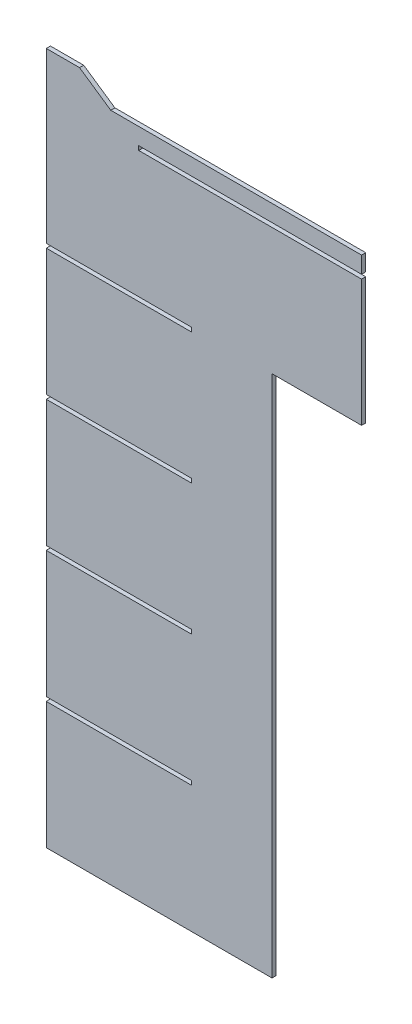
ISO-10303-21;
HEADER;
FILE_DESCRIPTION(('STEP AP214'),'2;1');
FILE_NAME('part.step','',(''),(''),'','','');
FILE_SCHEMA(('AUTOMOTIVE_DESIGN { 1 0 10303 214 1 1 1 1 }'));
ENDSEC;
DATA;
#1=APPLICATION_CONTEXT('core data for automotive mechanical design processes');
#2=APPLICATION_PROTOCOL_DEFINITION('international standard','automotive_design',2000,#1);
#3=PRODUCT_CONTEXT('',#1,'mechanical');
#4=PRODUCT('Part','Part','',(#3));
#5=PRODUCT_RELATED_PRODUCT_CATEGORY('part','',(#4));
#6=PRODUCT_DEFINITION_FORMATION('','',#4);
#7=PRODUCT_DEFINITION_CONTEXT('part definition',#1,'design');
#8=PRODUCT_DEFINITION('design','',#6,#7);
#9=PRODUCT_DEFINITION_SHAPE('','',#8);
#10=(LENGTH_UNIT() NAMED_UNIT(*) SI_UNIT(.MILLI.,.METRE.));
#11=(NAMED_UNIT(*) PLANE_ANGLE_UNIT() SI_UNIT($,.RADIAN.));
#12=(NAMED_UNIT(*) SI_UNIT($,.STERADIAN.) SOLID_ANGLE_UNIT());
#13=UNCERTAINTY_MEASURE_WITH_UNIT(LENGTH_MEASURE(1.E-05),#10,'distance_accuracy_value','');
#14=(GEOMETRIC_REPRESENTATION_CONTEXT(3) GLOBAL_UNCERTAINTY_ASSIGNED_CONTEXT((#13)) GLOBAL_UNIT_ASSIGNED_CONTEXT((#10,
#11,#12)) REPRESENTATION_CONTEXT('',''));
#15=CARTESIAN_POINT('',(0.,0.,0.));
#16=DIRECTION('',(0.,0.,1.));
#17=DIRECTION('',(1.,0.,0.));
#18=AXIS2_PLACEMENT_3D('',#15,#16,#17);
#19=CARTESIAN_POINT('',(129.013076167851,254.245404572339,3.175));
#20=DIRECTION('',(0.,-1.,0.));
#21=DIRECTION('',(0.,0.,-1.));
#22=AXIS2_PLACEMENT_3D('',#19,#20,#21);
#23=PLANE('',#22);
#24=DIRECTION('',(-1.,0.,0.));
#25=VECTOR('',#24,1.);
#26=CARTESIAN_POINT('',(129.013076167851,254.245404572339,0.));
#27=LINE('',#26,#25);
#28=CARTESIAN_POINT('',(221.723076167851,254.245404572339,0.));
#29=VERTEX_POINT('',#28);
#30=CARTESIAN_POINT('',(51.8072361678516,254.245404572339,0.));
#31=VERTEX_POINT('',#30);
#32=EDGE_CURVE('E210',#29,#31,#27,.T.);
#33=ORIENTED_EDGE('',*,*,#32,.T.);
#34=DIRECTION('',(0.,0.,1.));
#35=VECTOR('',#34,1.);
#36=CARTESIAN_POINT('',(51.8072361678516,254.245404572339,0.));
#37=LINE('',#36,#35);
#38=CARTESIAN_POINT('',(51.8072361678516,254.245404572339,3.175));
#39=VERTEX_POINT('',#38);
#40=EDGE_CURVE('E449',#31,#39,#37,.T.);
#41=ORIENTED_EDGE('',*,*,#40,.T.);
#42=DIRECTION('',(-1.,0.,0.));
#43=VECTOR('',#42,1.);
#44=CARTESIAN_POINT('',(129.013076167851,254.245404572339,3.175));
#45=LINE('',#44,#43);
#46=CARTESIAN_POINT('',(221.723076167851,254.245404572339,3.175));
#47=VERTEX_POINT('',#46);
#48=EDGE_CURVE('E268',#47,#39,#45,.T.);
#49=ORIENTED_EDGE('',*,*,#48,.F.);
#50=DIRECTION('',(0.,0.,1.));
#51=VECTOR('',#50,1.);
#52=CARTESIAN_POINT('',(221.723076167851,254.245404572339,0.));
#53=LINE('',#52,#51);
#54=EDGE_CURVE('E525',#29,#47,#53,.T.);
#55=ORIENTED_EDGE('',*,*,#54,.F.);
#56=EDGE_LOOP('',(#33,#41,#49,#55));
#57=FACE_BOUND('',#56,.T.);
#58=ADVANCED_FACE('F39',(#57),#23,.F.);
#59=CARTESIAN_POINT('',(-18.6853838321491,254.245404572339,3.175));
#60=DIRECTION('',(1.,0.,0.));
#61=DIRECTION('',(0.,0.,-1.));
#62=AXIS2_PLACEMENT_3D('',#59,#60,#61);
#63=PLANE('',#62);
#64=DIRECTION('',(0.,-1.,0.));
#65=VECTOR('',#64,1.);
#66=CARTESIAN_POINT('',(-18.6853838321491,254.245404572339,0.));
#67=LINE('',#66,#65);
#68=CARTESIAN_POINT('',(-18.6853838321491,286.376404572339,0.));
#69=VERTEX_POINT('',#68);
#70=CARTESIAN_POINT('',(-18.6853838321491,157.66698457234,0.));
#71=VERTEX_POINT('',#70);
#72=EDGE_CURVE('E214',#69,#71,#67,.T.);
#73=ORIENTED_EDGE('',*,*,#72,.T.);
#74=DIRECTION('',(0.,0.,-1.));
#75=VECTOR('',#74,1.);
#76=CARTESIAN_POINT('',(-18.6853838321491,157.66698457234,3.175));
#77=LINE('',#76,#75);
#78=CARTESIAN_POINT('',(-18.6853838321491,157.66698457234,3.175));
#79=VERTEX_POINT('',#78);
#80=EDGE_CURVE('E11',#79,#71,#77,.T.);
#81=ORIENTED_EDGE('',*,*,#80,.F.);
#82=DIRECTION('',(0.,-1.,0.));
#83=VECTOR('',#82,1.);
#84=CARTESIAN_POINT('',(-18.6853838321491,254.245404572339,3.175));
#85=LINE('',#84,#83);
#86=CARTESIAN_POINT('',(-18.6853838321491,286.376404572339,3.175));
#87=VERTEX_POINT('',#86);
#88=EDGE_CURVE('E131',#87,#79,#85,.T.);
#89=ORIENTED_EDGE('',*,*,#88,.F.);
#90=DIRECTION('',(0.,0.,1.));
#91=VECTOR('',#90,1.);
#92=CARTESIAN_POINT('',(-18.6853838321491,286.376404572339,0.));
#93=LINE('',#92,#91);
#94=EDGE_CURVE('E444',#69,#87,#93,.T.);
#95=ORIENTED_EDGE('',*,*,#94,.F.);
#96=EDGE_LOOP('',(#73,#81,#89,#95));
#97=FACE_BOUND('',#96,.T.);
#98=ADVANCED_FACE('F445',(#97),#63,.F.);
#99=CARTESIAN_POINT('',(92.0884611678498,157.66698457234,3.175));
#100=DIRECTION('',(0.,1.,0.));
#101=DIRECTION('',(0.,0.,1.));
#102=AXIS2_PLACEMENT_3D('',#99,#100,#101);
#103=PLANE('',#102);
#104=DIRECTION('',(1.,0.,0.));
#105=VECTOR('',#104,1.);
#106=CARTESIAN_POINT('',(92.0884611678498,157.66698457234,0.));
#107=LINE('',#106,#105);
#108=CARTESIAN_POINT('',(92.0884611678498,157.66698457234,0.));
#109=VERTEX_POINT('',#108);
#110=EDGE_CURVE('E218',#71,#109,#107,.T.);
#111=ORIENTED_EDGE('',*,*,#110,.T.);
#112=DIRECTION('',(0.,0.,-1.));
#113=VECTOR('',#112,1.);
#114=CARTESIAN_POINT('',(92.0884611678498,157.66698457234,3.175));
#115=LINE('',#114,#113);
#116=CARTESIAN_POINT('',(92.0884611678498,157.66698457234,3.175));
#117=VERTEX_POINT('',#116);
#118=EDGE_CURVE('E47',#117,#109,#115,.T.);
#119=ORIENTED_EDGE('',*,*,#118,.F.);
#120=DIRECTION('',(1.,0.,0.));
#121=VECTOR('',#120,1.);
#122=CARTESIAN_POINT('',(92.0884611678498,157.66698457234,3.175));
#123=LINE('',#122,#121);
#124=EDGE_CURVE('E504',#79,#117,#123,.T.);
#125=ORIENTED_EDGE('',*,*,#124,.F.);
#126=ORIENTED_EDGE('',*,*,#80,.T.);
#127=EDGE_LOOP('',(#111,#119,#125,#126));
#128=FACE_BOUND('',#127,.T.);
#129=ADVANCED_FACE('F507',(#128),#103,.F.);
#130=CARTESIAN_POINT('',(92.0884611678498,157.66698457234,3.175));
#131=DIRECTION('',(1.,0.,0.));
#132=DIRECTION('',(0.,0.,-1.));
#133=AXIS2_PLACEMENT_3D('',#130,#131,#132);
#134=PLANE('',#133);
#135=DIRECTION('',(0.,-1.,0.));
#136=VECTOR('',#135,1.);
#137=CARTESIAN_POINT('',(92.0884611678498,157.66698457234,0.));
#138=LINE('',#137,#136);
#139=CARTESIAN_POINT('',(92.0884611678498,154.49198457234,0.));
#140=VERTEX_POINT('',#139);
#141=EDGE_CURVE('E221',#109,#140,#138,.T.);
#142=ORIENTED_EDGE('',*,*,#141,.T.);
#143=DIRECTION('',(0.,0.,-1.));
#144=VECTOR('',#143,1.);
#145=CARTESIAN_POINT('',(92.0884611678498,154.49198457234,3.175));
#146=LINE('',#145,#144);
#147=CARTESIAN_POINT('',(92.0884611678498,154.49198457234,3.175));
#148=VERTEX_POINT('',#147);
#149=EDGE_CURVE('E315',#148,#140,#146,.T.);
#150=ORIENTED_EDGE('',*,*,#149,.F.);
#151=DIRECTION('',(0.,-1.,0.));
#152=VECTOR('',#151,1.);
#153=CARTESIAN_POINT('',(92.0884611678498,157.66698457234,3.175));
#154=LINE('',#153,#152);
#155=EDGE_CURVE('E326',#117,#148,#154,.T.);
#156=ORIENTED_EDGE('',*,*,#155,.F.);
#157=ORIENTED_EDGE('',*,*,#118,.T.);
#158=EDGE_LOOP('',(#142,#150,#156,#157));
#159=FACE_BOUND('',#158,.T.);
#160=ADVANCED_FACE('F324',(#159),#134,.F.);
#161=CARTESIAN_POINT('',(92.0884611678498,154.49198457234,3.175));
#162=DIRECTION('',(0.,-1.,0.));
#163=DIRECTION('',(1.,0.,0.));
#164=AXIS2_PLACEMENT_3D('',#161,#162,#163);
#165=PLANE('',#164);
#166=DIRECTION('',(-1.,0.,0.));
#167=VECTOR('',#166,1.);
#168=CARTESIAN_POINT('',(92.0884611678498,154.49198457234,0.));
#169=LINE('',#168,#167);
#170=CARTESIAN_POINT('',(-18.6853838321491,154.49198457234,0.));
#171=VERTEX_POINT('',#170);
#172=EDGE_CURVE('E224',#140,#171,#169,.T.);
#173=ORIENTED_EDGE('',*,*,#172,.T.);
#174=DIRECTION('',(0.,0.,-1.));
#175=VECTOR('',#174,1.);
#176=CARTESIAN_POINT('',(-18.6853838321491,154.49198457234,3.175));
#177=LINE('',#176,#175);
#178=CARTESIAN_POINT('',(-18.6853838321491,154.49198457234,3.175));
#179=VERTEX_POINT('',#178);
#180=EDGE_CURVE('E311',#179,#171,#177,.T.);
#181=ORIENTED_EDGE('',*,*,#180,.F.);
#182=DIRECTION('',(-1.,0.,0.));
#183=VECTOR('',#182,1.);
#184=CARTESIAN_POINT('',(92.0884611678498,154.49198457234,3.175));
#185=LINE('',#184,#183);
#186=EDGE_CURVE('E349',#148,#179,#185,.T.);
#187=ORIENTED_EDGE('',*,*,#186,.F.);
#188=ORIENTED_EDGE('',*,*,#149,.T.);
#189=EDGE_LOOP('',(#173,#181,#187,#188));
#190=FACE_BOUND('',#189,.T.);
#191=ADVANCED_FACE('F339',(#190),#165,.F.);
#192=CARTESIAN_POINT('',(-18.6853838321491,154.49198457234,3.175));
#193=DIRECTION('',(1.,0.,0.));
#194=DIRECTION('',(0.,0.,-1.));
#195=AXIS2_PLACEMENT_3D('',#192,#193,#194);
#196=PLANE('',#195);
#197=DIRECTION('',(0.,-1.,0.));
#198=VECTOR('',#197,1.);
#199=CARTESIAN_POINT('',(-18.6853838321491,154.49198457234,0.));
#200=LINE('',#199,#198);
#201=CARTESIAN_POINT('',(-18.6853838321491,57.9135645723403,0.));
#202=VERTEX_POINT('',#201);
#203=EDGE_CURVE('E227',#171,#202,#200,.T.);
#204=ORIENTED_EDGE('',*,*,#203,.T.);
#205=DIRECTION('',(0.,0.,-1.));
#206=VECTOR('',#205,1.);
#207=CARTESIAN_POINT('',(-18.6853838321491,57.9135645723403,3.175));
#208=LINE('',#207,#206);
#209=CARTESIAN_POINT('',(-18.6853838321491,57.9135645723403,3.175));
#210=VERTEX_POINT('',#209);
#211=EDGE_CURVE('E307',#210,#202,#208,.T.);
#212=ORIENTED_EDGE('',*,*,#211,.F.);
#213=DIRECTION('',(0.,-1.,0.));
#214=VECTOR('',#213,1.);
#215=CARTESIAN_POINT('',(-18.6853838321491,154.49198457234,3.175));
#216=LINE('',#215,#214);
#217=EDGE_CURVE('E345',#179,#210,#216,.T.);
#218=ORIENTED_EDGE('',*,*,#217,.F.);
#219=ORIENTED_EDGE('',*,*,#180,.T.);
#220=EDGE_LOOP('',(#204,#212,#218,#219));
#221=FACE_BOUND('',#220,.T.);
#222=ADVANCED_FACE('F343',(#221),#196,.F.);
#223=CARTESIAN_POINT('',(92.0884611678505,57.9135645723403,3.175));
#224=DIRECTION('',(0.,1.,0.));
#225=DIRECTION('',(0.,0.,1.));
#226=AXIS2_PLACEMENT_3D('',#223,#224,#225);
#227=PLANE('',#226);
#228=DIRECTION('',(1.,0.,0.));
#229=VECTOR('',#228,1.);
#230=CARTESIAN_POINT('',(92.0884611678505,57.9135645723403,0.));
#231=LINE('',#230,#229);
#232=CARTESIAN_POINT('',(92.0884611678505,57.9135645723403,0.));
#233=VERTEX_POINT('',#232);
#234=EDGE_CURVE('E230',#202,#233,#231,.T.);
#235=ORIENTED_EDGE('',*,*,#234,.T.);
#236=DIRECTION('',(0.,0.,-1.));
#237=VECTOR('',#236,1.);
#238=CARTESIAN_POINT('',(92.0884611678505,57.9135645723403,3.175));
#239=LINE('',#238,#237);
#240=CARTESIAN_POINT('',(92.0884611678505,57.9135645723403,3.175));
#241=VERTEX_POINT('',#240);
#242=EDGE_CURVE('E303',#241,#233,#239,.T.);
#243=ORIENTED_EDGE('',*,*,#242,.F.);
#244=DIRECTION('',(1.,0.,0.));
#245=VECTOR('',#244,1.);
#246=CARTESIAN_POINT('',(92.0884611678505,57.9135645723403,3.175));
#247=LINE('',#246,#245);
#248=EDGE_CURVE('E348',#210,#241,#247,.T.);
#249=ORIENTED_EDGE('',*,*,#248,.F.);
#250=ORIENTED_EDGE('',*,*,#211,.T.);
#251=EDGE_LOOP('',(#235,#243,#249,#250));
#252=FACE_BOUND('',#251,.T.);
#253=ADVANCED_FACE('F640',(#252),#227,.F.);
#254=CARTESIAN_POINT('',(92.0884611678505,57.9135645723403,3.175));
#255=DIRECTION('',(1.,0.,0.));
#256=DIRECTION('',(0.,0.,-1.));
#257=AXIS2_PLACEMENT_3D('',#254,#255,#256);
#258=PLANE('',#257);
#259=DIRECTION('',(0.,-1.,0.));
#260=VECTOR('',#259,1.);
#261=CARTESIAN_POINT('',(92.0884611678505,57.9135645723403,0.));
#262=LINE('',#261,#260);
#263=CARTESIAN_POINT('',(92.0884611678505,54.7385645723401,0.));
#264=VERTEX_POINT('',#263);
#265=EDGE_CURVE('E233',#233,#264,#262,.T.);
#266=ORIENTED_EDGE('',*,*,#265,.T.);
#267=DIRECTION('',(0.,0.,-1.));
#268=VECTOR('',#267,1.);
#269=CARTESIAN_POINT('',(92.0884611678505,54.7385645723401,3.175));
#270=LINE('',#269,#268);
#271=CARTESIAN_POINT('',(92.0884611678505,54.7385645723401,3.175));
#272=VERTEX_POINT('',#271);
#273=EDGE_CURVE('E299',#272,#264,#270,.T.);
#274=ORIENTED_EDGE('',*,*,#273,.F.);
#275=DIRECTION('',(0.,-1.,0.));
#276=VECTOR('',#275,1.);
#277=CARTESIAN_POINT('',(92.0884611678505,57.9135645723403,3.175));
#278=LINE('',#277,#276);
#279=EDGE_CURVE('E353',#241,#272,#278,.T.);
#280=ORIENTED_EDGE('',*,*,#279,.F.);
#281=ORIENTED_EDGE('',*,*,#242,.T.);
#282=EDGE_LOOP('',(#266,#274,#280,#281));
#283=FACE_BOUND('',#282,.T.);
#284=ADVANCED_FACE('F636',(#283),#258,.F.);
#285=CARTESIAN_POINT('',(92.0884611678505,54.7385645723401,3.175));
#286=DIRECTION('',(0.,-1.,0.));
#287=DIRECTION('',(1.,0.,0.));
#288=AXIS2_PLACEMENT_3D('',#285,#286,#287);
#289=PLANE('',#288);
#290=DIRECTION('',(-1.,0.,0.));
#291=VECTOR('',#290,1.);
#292=CARTESIAN_POINT('',(92.0884611678505,54.7385645723401,0.));
#293=LINE('',#292,#291);
#294=CARTESIAN_POINT('',(-18.6853838321491,54.7385645723401,0.));
#295=VERTEX_POINT('',#294);
#296=EDGE_CURVE('E236',#264,#295,#293,.T.);
#297=ORIENTED_EDGE('',*,*,#296,.T.);
#298=DIRECTION('',(0.,0.,-1.));
#299=VECTOR('',#298,1.);
#300=CARTESIAN_POINT('',(-18.6853838321491,54.7385645723401,3.175));
#301=LINE('',#300,#299);
#302=CARTESIAN_POINT('',(-18.6853838321491,54.7385645723401,3.175));
#303=VERTEX_POINT('',#302);
#304=EDGE_CURVE('E295',#303,#295,#301,.T.);
#305=ORIENTED_EDGE('',*,*,#304,.F.);
#306=DIRECTION('',(-1.,0.,0.));
#307=VECTOR('',#306,1.);
#308=CARTESIAN_POINT('',(92.0884611678505,54.7385645723401,3.175));
#309=LINE('',#308,#307);
#310=EDGE_CURVE('E360',#272,#303,#309,.T.);
#311=ORIENTED_EDGE('',*,*,#310,.F.);
#312=ORIENTED_EDGE('',*,*,#273,.T.);
#313=EDGE_LOOP('',(#297,#305,#311,#312));
#314=FACE_BOUND('',#313,.T.);
#315=ADVANCED_FACE('F632',(#314),#289,.F.);
#316=CARTESIAN_POINT('',(-18.6853838321491,54.7385645723401,3.175));
#317=DIRECTION('',(1.,0.,0.));
#318=DIRECTION('',(0.,0.,-1.));
#319=AXIS2_PLACEMENT_3D('',#316,#317,#318);
#320=PLANE('',#319);
#321=DIRECTION('',(0.,-1.,0.));
#322=VECTOR('',#321,1.);
#323=CARTESIAN_POINT('',(-18.6853838321491,54.7385645723401,0.));
#324=LINE('',#323,#322);
#325=CARTESIAN_POINT('',(-18.6853838321491,-41.8398554276617,0.));
#326=VERTEX_POINT('',#325);
#327=EDGE_CURVE('E239',#295,#326,#324,.T.);
#328=ORIENTED_EDGE('',*,*,#327,.T.);
#329=DIRECTION('',(0.,0.,-1.));
#330=VECTOR('',#329,1.);
#331=CARTESIAN_POINT('',(-18.6853838321491,-41.8398554276617,3.175));
#332=LINE('',#331,#330);
#333=CARTESIAN_POINT('',(-18.6853838321491,-41.8398554276617,3.175));
#334=VERTEX_POINT('',#333);
#335=EDGE_CURVE('E291',#334,#326,#332,.T.);
#336=ORIENTED_EDGE('',*,*,#335,.F.);
#337=DIRECTION('',(0.,-1.,0.));
#338=VECTOR('',#337,1.);
#339=CARTESIAN_POINT('',(-18.6853838321491,54.7385645723401,3.175));
#340=LINE('',#339,#338);
#341=EDGE_CURVE('E363',#303,#334,#340,.T.);
#342=ORIENTED_EDGE('',*,*,#341,.F.);
#343=ORIENTED_EDGE('',*,*,#304,.T.);
#344=EDGE_LOOP('',(#328,#336,#342,#343));
#345=FACE_BOUND('',#344,.T.);
#346=ADVANCED_FACE('F628',(#345),#320,.F.);
#347=CARTESIAN_POINT('',(92.0884611678512,-41.8398554276617,3.175));
#348=DIRECTION('',(0.,1.,0.));
#349=DIRECTION('',(0.,0.,1.));
#350=AXIS2_PLACEMENT_3D('',#347,#348,#349);
#351=PLANE('',#350);
#352=DIRECTION('',(1.,0.,0.));
#353=VECTOR('',#352,1.);
#354=CARTESIAN_POINT('',(92.0884611678512,-41.8398554276617,0.));
#355=LINE('',#354,#353);
#356=CARTESIAN_POINT('',(92.0884611678512,-41.8398554276617,0.));
#357=VERTEX_POINT('',#356);
#358=EDGE_CURVE('E242',#326,#357,#355,.T.);
#359=ORIENTED_EDGE('',*,*,#358,.T.);
#360=DIRECTION('',(0.,0.,-1.));
#361=VECTOR('',#360,1.);
#362=CARTESIAN_POINT('',(92.0884611678512,-41.8398554276617,3.175));
#363=LINE('',#362,#361);
#364=CARTESIAN_POINT('',(92.0884611678512,-41.8398554276617,3.175));
#365=VERTEX_POINT('',#364);
#366=EDGE_CURVE('E287',#365,#357,#363,.T.);
#367=ORIENTED_EDGE('',*,*,#366,.F.);
#368=DIRECTION('',(1.,0.,0.));
#369=VECTOR('',#368,1.);
#370=CARTESIAN_POINT('',(92.0884611678512,-41.8398554276617,3.175));
#371=LINE('',#370,#369);
#372=EDGE_CURVE('E366',#334,#365,#371,.T.);
#373=ORIENTED_EDGE('',*,*,#372,.F.);
#374=ORIENTED_EDGE('',*,*,#335,.T.);
#375=EDGE_LOOP('',(#359,#367,#373,#374));
#376=FACE_BOUND('',#375,.T.);
#377=ADVANCED_FACE('F624',(#376),#351,.F.);
#378=CARTESIAN_POINT('',(92.0884611678512,-41.8398554276617,3.175));
#379=DIRECTION('',(1.,0.,0.));
#380=DIRECTION('',(0.,0.,-1.));
#381=AXIS2_PLACEMENT_3D('',#378,#379,#380);
#382=PLANE('',#381);
#383=DIRECTION('',(0.,-1.,0.));
#384=VECTOR('',#383,1.);
#385=CARTESIAN_POINT('',(92.0884611678512,-41.8398554276617,0.));
#386=LINE('',#385,#384);
#387=CARTESIAN_POINT('',(92.0884611678512,-45.0148554276619,0.));
#388=VERTEX_POINT('',#387);
#389=EDGE_CURVE('E245',#357,#388,#386,.T.);
#390=ORIENTED_EDGE('',*,*,#389,.T.);
#391=DIRECTION('',(0.,0.,-1.));
#392=VECTOR('',#391,1.);
#393=CARTESIAN_POINT('',(92.0884611678512,-45.0148554276619,3.175));
#394=LINE('',#393,#392);
#395=CARTESIAN_POINT('',(92.0884611678512,-45.0148554276619,3.175));
#396=VERTEX_POINT('',#395);
#397=EDGE_CURVE('E283',#396,#388,#394,.T.);
#398=ORIENTED_EDGE('',*,*,#397,.F.);
#399=DIRECTION('',(0.,-1.,0.));
#400=VECTOR('',#399,1.);
#401=CARTESIAN_POINT('',(92.0884611678512,-41.8398554276617,3.175));
#402=LINE('',#401,#400);
#403=EDGE_CURVE('E369',#365,#396,#402,.T.);
#404=ORIENTED_EDGE('',*,*,#403,.F.);
#405=ORIENTED_EDGE('',*,*,#366,.T.);
#406=EDGE_LOOP('',(#390,#398,#404,#405));
#407=FACE_BOUND('',#406,.T.);
#408=ADVANCED_FACE('F620',(#407),#382,.F.);
#409=CARTESIAN_POINT('',(92.0884611678512,-45.0148554276619,3.175));
#410=DIRECTION('',(0.,-1.,0.));
#411=DIRECTION('',(1.,0.,0.));
#412=AXIS2_PLACEMENT_3D('',#409,#410,#411);
#413=PLANE('',#412);
#414=DIRECTION('',(-1.,0.,0.));
#415=VECTOR('',#414,1.);
#416=CARTESIAN_POINT('',(92.0884611678512,-45.0148554276619,0.));
#417=LINE('',#416,#415);
#418=CARTESIAN_POINT('',(-18.6853838321491,-45.0148554276619,0.));
#419=VERTEX_POINT('',#418);
#420=EDGE_CURVE('E248',#388,#419,#417,.T.);
#421=ORIENTED_EDGE('',*,*,#420,.T.);
#422=DIRECTION('',(0.,0.,-1.));
#423=VECTOR('',#422,1.);
#424=CARTESIAN_POINT('',(-18.6853838321491,-45.0148554276619,3.175));
#425=LINE('',#424,#423);
#426=CARTESIAN_POINT('',(-18.6853838321491,-45.0148554276619,3.175));
#427=VERTEX_POINT('',#426);
#428=EDGE_CURVE('E279',#427,#419,#425,.T.);
#429=ORIENTED_EDGE('',*,*,#428,.F.);
#430=DIRECTION('',(-1.,0.,0.));
#431=VECTOR('',#430,1.);
#432=CARTESIAN_POINT('',(92.0884611678512,-45.0148554276619,3.175));
#433=LINE('',#432,#431);
#434=EDGE_CURVE('E372',#396,#427,#433,.T.);
#435=ORIENTED_EDGE('',*,*,#434,.F.);
#436=ORIENTED_EDGE('',*,*,#397,.T.);
#437=EDGE_LOOP('',(#421,#429,#435,#436));
#438=FACE_BOUND('',#437,.T.);
#439=ADVANCED_FACE('F617',(#438),#413,.F.);
#440=CARTESIAN_POINT('',(-18.6853838321491,-45.0148554276619,3.175));
#441=DIRECTION('',(1.,0.,0.));
#442=DIRECTION('',(0.,0.,-1.));
#443=AXIS2_PLACEMENT_3D('',#440,#441,#442);
#444=PLANE('',#443);
#445=DIRECTION('',(0.,-1.,0.));
#446=VECTOR('',#445,1.);
#447=CARTESIAN_POINT('',(-18.6853838321491,-45.0148554276619,0.));
#448=LINE('',#447,#446);
#449=CARTESIAN_POINT('',(-18.6853838321491,-141.59327542766,0.));
#450=VERTEX_POINT('',#449);
#451=EDGE_CURVE('E251',#419,#450,#448,.T.);
#452=ORIENTED_EDGE('',*,*,#451,.T.);
#453=DIRECTION('',(0.,0.,-1.));
#454=VECTOR('',#453,1.);
#455=CARTESIAN_POINT('',(-18.6853838321491,-141.59327542766,3.175));
#456=LINE('',#455,#454);
#457=CARTESIAN_POINT('',(-18.6853838321491,-141.59327542766,3.175));
#458=VERTEX_POINT('',#457);
#459=EDGE_CURVE('E275',#458,#450,#456,.T.);
#460=ORIENTED_EDGE('',*,*,#459,.F.);
#461=DIRECTION('',(0.,-1.,0.));
#462=VECTOR('',#461,1.);
#463=CARTESIAN_POINT('',(-18.6853838321491,-45.0148554276619,3.175));
#464=LINE('',#463,#462);
#465=EDGE_CURVE('E375',#427,#458,#464,.T.);
#466=ORIENTED_EDGE('',*,*,#465,.F.);
#467=ORIENTED_EDGE('',*,*,#428,.T.);
#468=EDGE_LOOP('',(#452,#460,#466,#467));
#469=FACE_BOUND('',#468,.T.);
#470=ADVANCED_FACE('F383',(#469),#444,.F.);
#471=CARTESIAN_POINT('',(92.0884611678519,-141.59327542766,3.175));
#472=DIRECTION('',(0.,1.,0.));
#473=DIRECTION('',(0.,0.,1.));
#474=AXIS2_PLACEMENT_3D('',#471,#472,#473);
#475=PLANE('',#474);
#476=DIRECTION('',(1.,0.,0.));
#477=VECTOR('',#476,1.);
#478=CARTESIAN_POINT('',(92.0884611678519,-141.59327542766,0.));
#479=LINE('',#478,#477);
#480=CARTESIAN_POINT('',(92.0884611678519,-141.59327542766,0.));
#481=VERTEX_POINT('',#480);
#482=EDGE_CURVE('E254',#450,#481,#479,.T.);
#483=ORIENTED_EDGE('',*,*,#482,.T.);
#484=DIRECTION('',(0.,0.,-1.));
#485=VECTOR('',#484,1.);
#486=CARTESIAN_POINT('',(92.0884611678519,-141.59327542766,3.175));
#487=LINE('',#486,#485);
#488=CARTESIAN_POINT('',(92.0884611678519,-141.59327542766,3.175));
#489=VERTEX_POINT('',#488);
#490=EDGE_CURVE('E196',#489,#481,#487,.T.);
#491=ORIENTED_EDGE('',*,*,#490,.F.);
#492=DIRECTION('',(1.,0.,0.));
#493=VECTOR('',#492,1.);
#494=CARTESIAN_POINT('',(92.0884611678519,-141.59327542766,3.175));
#495=LINE('',#494,#493);
#496=EDGE_CURVE('E182',#458,#489,#495,.T.);
#497=ORIENTED_EDGE('',*,*,#496,.F.);
#498=ORIENTED_EDGE('',*,*,#459,.T.);
#499=EDGE_LOOP('',(#483,#491,#497,#498));
#500=FACE_BOUND('',#499,.T.);
#501=ADVANCED_FACE('F387',(#500),#475,.F.);
#502=CARTESIAN_POINT('',(92.0884611678519,-141.59327542766,3.175));
#503=DIRECTION('',(1.,0.,0.));
#504=DIRECTION('',(0.,0.,-1.));
#505=AXIS2_PLACEMENT_3D('',#502,#503,#504);
#506=PLANE('',#505);
#507=DIRECTION('',(0.,-1.,0.));
#508=VECTOR('',#507,1.);
#509=CARTESIAN_POINT('',(92.0884611678519,-141.59327542766,0.));
#510=LINE('',#509,#508);
#511=CARTESIAN_POINT('',(92.0884611678519,-144.76827542766,0.));
#512=VERTEX_POINT('',#511);
#513=EDGE_CURVE('E192',#481,#512,#510,.T.);
#514=ORIENTED_EDGE('',*,*,#513,.T.);
#515=DIRECTION('',(0.,0.,-1.));
#516=VECTOR('',#515,1.);
#517=CARTESIAN_POINT('',(92.0884611678519,-144.76827542766,3.175));
#518=LINE('',#517,#516);
#519=CARTESIAN_POINT('',(92.0884611678519,-144.76827542766,3.175));
#520=VERTEX_POINT('',#519);
#521=EDGE_CURVE('E189',#520,#512,#518,.T.);
#522=ORIENTED_EDGE('',*,*,#521,.F.);
#523=DIRECTION('',(0.,-1.,0.));
#524=VECTOR('',#523,1.);
#525=CARTESIAN_POINT('',(92.0884611678519,-141.59327542766,3.175));
#526=LINE('',#525,#524);
#527=EDGE_CURVE('E175',#489,#520,#526,.T.);
#528=ORIENTED_EDGE('',*,*,#527,.F.);
#529=ORIENTED_EDGE('',*,*,#490,.T.);
#530=EDGE_LOOP('',(#514,#522,#528,#529));
#531=FACE_BOUND('',#530,.T.);
#532=ADVANCED_FACE('F190',(#531),#506,.F.);
#533=CARTESIAN_POINT('',(92.0884611678519,-144.76827542766,3.175));
#534=DIRECTION('',(0.,-1.,0.));
#535=DIRECTION('',(1.,0.,0.));
#536=AXIS2_PLACEMENT_3D('',#533,#534,#535);
#537=PLANE('',#536);
#538=DIRECTION('',(-1.,0.,0.));
#539=VECTOR('',#538,1.);
#540=CARTESIAN_POINT('',(92.0884611678519,-144.76827542766,0.));
#541=LINE('',#540,#539);
#542=CARTESIAN_POINT('',(-18.6853838321491,-144.76827542766,0.));
#543=VERTEX_POINT('',#542);
#544=EDGE_CURVE('E259',#512,#543,#541,.T.);
#545=ORIENTED_EDGE('',*,*,#544,.T.);
#546=DIRECTION('',(0.,0.,-1.));
#547=VECTOR('',#546,1.);
#548=CARTESIAN_POINT('',(-18.6853838321491,-144.76827542766,3.175));
#549=LINE('',#548,#547);
#550=CARTESIAN_POINT('',(-18.6853838321491,-144.76827542766,3.175));
#551=VERTEX_POINT('',#550);
#552=EDGE_CURVE('E197',#551,#543,#549,.T.);
#553=ORIENTED_EDGE('',*,*,#552,.F.);
#554=DIRECTION('',(-1.,0.,0.));
#555=VECTOR('',#554,1.);
#556=CARTESIAN_POINT('',(92.0884611678519,-144.76827542766,3.175));
#557=LINE('',#556,#555);
#558=EDGE_CURVE('E179',#520,#551,#557,.T.);
#559=ORIENTED_EDGE('',*,*,#558,.F.);
#560=ORIENTED_EDGE('',*,*,#521,.T.);
#561=EDGE_LOOP('',(#545,#553,#559,#560));
#562=FACE_BOUND('',#561,.T.);
#563=ADVANCED_FACE('F199',(#562),#537,.F.);
#564=CARTESIAN_POINT('',(-18.6853838321491,-144.76827542766,3.175));
#565=DIRECTION('',(1.,0.,0.));
#566=DIRECTION('',(0.,0.,-1.));
#567=AXIS2_PLACEMENT_3D('',#564,#565,#566);
#568=PLANE('',#567);
#569=DIRECTION('',(0.,-1.,0.));
#570=VECTOR('',#569,1.);
#571=CARTESIAN_POINT('',(-18.6853838321491,-144.76827542766,0.));
#572=LINE('',#571,#570);
#573=CARTESIAN_POINT('',(-18.6853838321491,-241.346695427661,0.));
#574=VERTEX_POINT('',#573);
#575=EDGE_CURVE('E123',#543,#574,#572,.T.);
#576=ORIENTED_EDGE('',*,*,#575,.T.);
#577=DIRECTION('',(0.,0.,-1.));
#578=VECTOR('',#577,1.);
#579=CARTESIAN_POINT('',(-18.6853838321491,-241.346695427661,3.175));
#580=LINE('',#579,#578);
#581=CARTESIAN_POINT('',(-18.6853838321491,-241.346695427661,3.175));
#582=VERTEX_POINT('',#581);
#583=EDGE_CURVE('E209',#582,#574,#580,.T.);
#584=ORIENTED_EDGE('',*,*,#583,.F.);
#585=DIRECTION('',(0.,-1.,0.));
#586=VECTOR('',#585,1.);
#587=CARTESIAN_POINT('',(-18.6853838321491,-144.76827542766,3.175));
#588=LINE('',#587,#586);
#589=EDGE_CURVE('E63',#551,#582,#588,.T.);
#590=ORIENTED_EDGE('',*,*,#589,.F.);
#591=ORIENTED_EDGE('',*,*,#552,.T.);
#592=EDGE_LOOP('',(#576,#584,#590,#591));
#593=FACE_BOUND('',#592,.T.);
#594=ADVANCED_FACE('F389',(#593),#568,.F.);
#595=CARTESIAN_POINT('',(129.013076167851,-241.346695427661,3.175));
#596=DIRECTION('',(0.,1.,0.));
#597=DIRECTION('',(0.,0.,1.));
#598=AXIS2_PLACEMENT_3D('',#595,#596,#597);
#599=PLANE('',#598);
#600=DIRECTION('',(1.,0.,0.));
#601=VECTOR('',#600,1.);
#602=CARTESIAN_POINT('',(129.013076167851,-241.346695427661,0.));
#603=LINE('',#602,#601);
#604=CARTESIAN_POINT('',(153.407236167851,-241.346695427661,0.));
#605=VERTEX_POINT('',#604);
#606=EDGE_CURVE('E264',#574,#605,#603,.T.);
#607=ORIENTED_EDGE('',*,*,#606,.T.);
#608=DIRECTION('',(0.,0.,1.));
#609=VECTOR('',#608,1.);
#610=CARTESIAN_POINT('',(153.407236167851,-241.346695427661,0.));
#611=LINE('',#610,#609);
#612=CARTESIAN_POINT('',(153.407236167851,-241.346695427661,3.175));
#613=VERTEX_POINT('',#612);
#614=EDGE_CURVE('E215',#605,#613,#611,.T.);
#615=ORIENTED_EDGE('',*,*,#614,.T.);
#616=DIRECTION('',(1.,0.,0.));
#617=VECTOR('',#616,1.);
#618=CARTESIAN_POINT('',(129.013076167851,-241.346695427661,3.175));
#619=LINE('',#618,#617);
#620=EDGE_CURVE('E203',#582,#613,#619,.T.);
#621=ORIENTED_EDGE('',*,*,#620,.F.);
#622=ORIENTED_EDGE('',*,*,#583,.T.);
#623=EDGE_LOOP('',(#607,#615,#621,#622));
#624=FACE_BOUND('',#623,.T.);
#625=ADVANCED_FACE('F393',(#624),#599,.F.);
#626=CARTESIAN_POINT('',(0.,0.,3.175));
#627=DIRECTION('',(0.,0.,-1.));
#628=DIRECTION('',(-1.,0.,0.));
#629=AXIS2_PLACEMENT_3D('',#626,#627,#628);
#630=PLANE('',#629);
#631=ORIENTED_EDGE('',*,*,#620,.T.);
#632=DIRECTION('',(0.,1.,0.));
#633=VECTOR('',#632,1.);
#634=CARTESIAN_POINT('',(153.407236167851,254.245404572339,3.175));
#635=LINE('',#634,#633);
#636=CARTESIAN_POINT('',(153.407236167851,157.66698457234,3.175));
#637=VERTEX_POINT('',#636);
#638=EDGE_CURVE('E399',#613,#637,#635,.T.);
#639=ORIENTED_EDGE('',*,*,#638,.T.);
#640=DIRECTION('',(1.,0.,0.));
#641=VECTOR('',#640,1.);
#642=CARTESIAN_POINT('',(153.407236167851,157.66698457234,3.175));
#643=LINE('',#642,#641);
#644=CARTESIAN_POINT('',(221.723076167851,157.66698457234,3.175));
#645=VERTEX_POINT('',#644);
#646=EDGE_CURVE('E873',#637,#645,#643,.T.);
#647=ORIENTED_EDGE('',*,*,#646,.T.);
#648=DIRECTION('',(0.,1.,0.));
#649=VECTOR('',#648,1.);
#650=CARTESIAN_POINT('',(221.723076167851,254.245404572339,3.175));
#651=LINE('',#650,#649);
#652=EDGE_CURVE('E879',#645,#47,#651,.T.);
#653=ORIENTED_EDGE('',*,*,#652,.T.);
#654=ORIENTED_EDGE('',*,*,#48,.T.);
#655=DIRECTION('',(0.,1.,0.));
#656=VECTOR('',#655,1.);
#657=CARTESIAN_POINT('',(51.8072361678516,257.420404572339,3.175));
#658=LINE('',#657,#656);
#659=CARTESIAN_POINT('',(51.8072361678516,257.420404572339,3.175));
#660=VERTEX_POINT('',#659);
#661=EDGE_CURVE('E54',#39,#660,#658,.T.);
#662=ORIENTED_EDGE('',*,*,#661,.T.);
#663=DIRECTION('',(1.,0.,0.));
#664=VECTOR('',#663,1.);
#665=CARTESIAN_POINT('',(153.407236167851,257.420404572339,3.175));
#666=LINE('',#665,#664);
#667=CARTESIAN_POINT('',(221.723076167851,257.420404572339,3.175));
#668=VERTEX_POINT('',#667);
#669=EDGE_CURVE('E464',#660,#668,#666,.T.);
#670=ORIENTED_EDGE('',*,*,#669,.T.);
#671=DIRECTION('',(0.,1.,0.));
#672=VECTOR('',#671,1.);
#673=CARTESIAN_POINT('',(221.723076167851,270.120404572339,3.175));
#674=LINE('',#673,#672);
#675=CARTESIAN_POINT('',(221.723076167851,270.120404572339,3.175));
#676=VERTEX_POINT('',#675);
#677=EDGE_CURVE('E570',#668,#676,#674,.T.);
#678=ORIENTED_EDGE('',*,*,#677,.T.);
#679=DIRECTION('',(-1.,0.,0.));
#680=VECTOR('',#679,1.);
#681=CARTESIAN_POINT('',(153.407236167851,270.120404572339,3.175));
#682=LINE('',#681,#680);
#683=CARTESIAN_POINT('',(30.4963051092992,270.120404572339,3.175));
#684=VERTEX_POINT('',#683);
#685=EDGE_CURVE('E468',#676,#684,#682,.T.);
#686=ORIENTED_EDGE('',*,*,#685,.T.);
#687=DIRECTION('',(-0.82556088140597,0.564313061245439,0.));
#688=VECTOR('',#687,1.);
#689=CARTESIAN_POINT('',(30.4963051092992,270.120404572339,3.175));
#690=LINE('',#689,#688);
#691=CARTESIAN_POINT('',(6.71461616785089,286.376404572339,3.175));
#692=VERTEX_POINT('',#691);
#693=EDGE_CURVE('E473',#684,#692,#690,.T.);
#694=ORIENTED_EDGE('',*,*,#693,.T.);
#695=DIRECTION('',(-1.,0.,0.));
#696=VECTOR('',#695,1.);
#697=CARTESIAN_POINT('',(-18.6853838321491,286.376404572339,3.175));
#698=LINE('',#697,#696);
#699=EDGE_CURVE('E477',#692,#87,#698,.T.);
#700=ORIENTED_EDGE('',*,*,#699,.T.);
#701=ORIENTED_EDGE('',*,*,#88,.T.);
#702=ORIENTED_EDGE('',*,*,#124,.T.);
#703=ORIENTED_EDGE('',*,*,#155,.T.);
#704=ORIENTED_EDGE('',*,*,#186,.T.);
#705=ORIENTED_EDGE('',*,*,#217,.T.);
#706=ORIENTED_EDGE('',*,*,#248,.T.);
#707=ORIENTED_EDGE('',*,*,#279,.T.);
#708=ORIENTED_EDGE('',*,*,#310,.T.);
#709=ORIENTED_EDGE('',*,*,#341,.T.);
#710=ORIENTED_EDGE('',*,*,#372,.T.);
#711=ORIENTED_EDGE('',*,*,#403,.T.);
#712=ORIENTED_EDGE('',*,*,#434,.T.);
#713=ORIENTED_EDGE('',*,*,#465,.T.);
#714=ORIENTED_EDGE('',*,*,#496,.T.);
#715=ORIENTED_EDGE('',*,*,#527,.T.);
#716=ORIENTED_EDGE('',*,*,#558,.T.);
#717=ORIENTED_EDGE('',*,*,#589,.T.);
#718=EDGE_LOOP('',(#631,#639,#647,#653,#654,#662,#670,#678,#686,#694,#700,#701,#702,#703,#704,
#705,#706,#707,#708,#709,#710,#711,#712,#713,#714,#715,#716,#717));
#719=FACE_BOUND('',#718,.T.);
#720=ADVANCED_FACE('F177',(#719),#630,.F.);
#721=CARTESIAN_POINT('',(0.,0.,0.));
#722=DIRECTION('',(0.,0.,-1.));
#723=DIRECTION('',(-1.,0.,0.));
#724=AXIS2_PLACEMENT_3D('',#721,#722,#723);
#725=PLANE('',#724);
#726=ORIENTED_EDGE('',*,*,#32,.F.);
#727=DIRECTION('',(0.,1.,0.));
#728=VECTOR('',#727,1.);
#729=CARTESIAN_POINT('',(221.723076167851,254.245404572339,0.));
#730=LINE('',#729,#728);
#731=CARTESIAN_POINT('',(221.723076167851,157.66698457234,0.));
#732=VERTEX_POINT('',#731);
#733=EDGE_CURVE('E531',#732,#29,#730,.T.);
#734=ORIENTED_EDGE('',*,*,#733,.F.);
#735=DIRECTION('',(1.,0.,0.));
#736=VECTOR('',#735,1.);
#737=CARTESIAN_POINT('',(153.407236167851,157.66698457234,0.));
#738=LINE('',#737,#736);
#739=CARTESIAN_POINT('',(153.407236167851,157.66698457234,0.));
#740=VERTEX_POINT('',#739);
#741=EDGE_CURVE('E885',#740,#732,#738,.T.);
#742=ORIENTED_EDGE('',*,*,#741,.F.);
#743=DIRECTION('',(0.,1.,0.));
#744=VECTOR('',#743,1.);
#745=CARTESIAN_POINT('',(153.407236167851,254.245404572339,0.));
#746=LINE('',#745,#744);
#747=EDGE_CURVE('E491',#605,#740,#746,.T.);
#748=ORIENTED_EDGE('',*,*,#747,.F.);
#749=ORIENTED_EDGE('',*,*,#606,.F.);
#750=ORIENTED_EDGE('',*,*,#575,.F.);
#751=ORIENTED_EDGE('',*,*,#544,.F.);
#752=ORIENTED_EDGE('',*,*,#513,.F.);
#753=ORIENTED_EDGE('',*,*,#482,.F.);
#754=ORIENTED_EDGE('',*,*,#451,.F.);
#755=ORIENTED_EDGE('',*,*,#420,.F.);
#756=ORIENTED_EDGE('',*,*,#389,.F.);
#757=ORIENTED_EDGE('',*,*,#358,.F.);
#758=ORIENTED_EDGE('',*,*,#327,.F.);
#759=ORIENTED_EDGE('',*,*,#296,.F.);
#760=ORIENTED_EDGE('',*,*,#265,.F.);
#761=ORIENTED_EDGE('',*,*,#234,.F.);
#762=ORIENTED_EDGE('',*,*,#203,.F.);
#763=ORIENTED_EDGE('',*,*,#172,.F.);
#764=ORIENTED_EDGE('',*,*,#141,.F.);
#765=ORIENTED_EDGE('',*,*,#110,.F.);
#766=ORIENTED_EDGE('',*,*,#72,.F.);
#767=DIRECTION('',(-1.,0.,0.));
#768=VECTOR('',#767,1.);
#769=CARTESIAN_POINT('',(-18.6853838321491,286.376404572339,0.));
#770=LINE('',#769,#768);
#771=CARTESIAN_POINT('',(6.71461616785089,286.376404572339,0.));
#772=VERTEX_POINT('',#771);
#773=EDGE_CURVE('E441',#772,#69,#770,.T.);
#774=ORIENTED_EDGE('',*,*,#773,.F.);
#775=DIRECTION('',(-0.82556088140597,0.564313061245439,0.));
#776=VECTOR('',#775,1.);
#777=CARTESIAN_POINT('',(30.4963051092992,270.120404572339,0.));
#778=LINE('',#777,#776);
#779=CARTESIAN_POINT('',(30.4963051092992,270.120404572339,0.));
#780=VERTEX_POINT('',#779);
#781=EDGE_CURVE('E455',#780,#772,#778,.T.);
#782=ORIENTED_EDGE('',*,*,#781,.F.);
#783=DIRECTION('',(-1.,0.,0.));
#784=VECTOR('',#783,1.);
#785=CARTESIAN_POINT('',(153.407236167851,270.120404572339,0.));
#786=LINE('',#785,#784);
#787=CARTESIAN_POINT('',(221.723076167851,270.120404572339,0.));
#788=VERTEX_POINT('',#787);
#789=EDGE_CURVE('E460',#788,#780,#786,.T.);
#790=ORIENTED_EDGE('',*,*,#789,.F.);
#791=DIRECTION('',(0.,1.,0.));
#792=VECTOR('',#791,1.);
#793=CARTESIAN_POINT('',(221.723076167851,270.120404572339,0.));
#794=LINE('',#793,#792);
#795=CARTESIAN_POINT('',(221.723076167851,257.420404572339,0.));
#796=VERTEX_POINT('',#795);
#797=EDGE_CURVE('E554',#796,#788,#794,.T.);
#798=ORIENTED_EDGE('',*,*,#797,.F.);
#799=DIRECTION('',(1.,0.,0.));
#800=VECTOR('',#799,1.);
#801=CARTESIAN_POINT('',(153.407236167851,257.420404572339,0.));
#802=LINE('',#801,#800);
#803=CARTESIAN_POINT('',(51.8072361678516,257.420404572339,0.));
#804=VERTEX_POINT('',#803);
#805=EDGE_CURVE('E482',#804,#796,#802,.T.);
#806=ORIENTED_EDGE('',*,*,#805,.F.);
#807=DIRECTION('',(0.,1.,0.));
#808=VECTOR('',#807,1.);
#809=CARTESIAN_POINT('',(51.8072361678516,257.420404572339,0.));
#810=LINE('',#809,#808);
#811=EDGE_CURVE('E454',#31,#804,#810,.T.);
#812=ORIENTED_EDGE('',*,*,#811,.F.);
#813=EDGE_LOOP('',(#726,#734,#742,#748,#749,#750,#751,#752,#753,#754,#755,#756,#757,#758,#759,
#760,#761,#762,#763,#764,#765,#766,#774,#782,#790,#798,#806,#812));
#814=FACE_BOUND('',#813,.T.);
#815=ADVANCED_FACE('F333',(#814),#725,.T.);
#816=CARTESIAN_POINT('',(153.407236167851,254.245404572339,0.));
#817=DIRECTION('',(1.,0.,0.));
#818=DIRECTION('',(0.,1.,0.));
#819=AXIS2_PLACEMENT_3D('',#816,#817,#818);
#820=PLANE('',#819);
#821=DIRECTION('',(0.,0.,1.));
#822=VECTOR('',#821,1.);
#823=CARTESIAN_POINT('',(153.407236167851,157.66698457234,0.));
#824=LINE('',#823,#822);
#825=EDGE_CURVE('E577',#740,#637,#824,.T.);
#826=ORIENTED_EDGE('',*,*,#825,.T.);
#827=ORIENTED_EDGE('',*,*,#638,.F.);
#828=ORIENTED_EDGE('',*,*,#614,.F.);
#829=ORIENTED_EDGE('',*,*,#747,.T.);
#830=EDGE_LOOP('',(#826,#827,#828,#829));
#831=FACE_BOUND('',#830,.T.);
#832=ADVANCED_FACE('F591',(#831),#820,.T.);
#833=CARTESIAN_POINT('',(153.407236167851,257.420404572339,0.));
#834=DIRECTION('',(0.,-1.,0.));
#835=DIRECTION('',(0.,0.,-1.));
#836=AXIS2_PLACEMENT_3D('',#833,#834,#835);
#837=PLANE('',#836);
#838=ORIENTED_EDGE('',*,*,#669,.F.);
#839=DIRECTION('',(0.,0.,1.));
#840=VECTOR('',#839,1.);
#841=CARTESIAN_POINT('',(51.8072361678516,257.420404572339,0.));
#842=LINE('',#841,#840);
#843=EDGE_CURVE('E407',#804,#660,#842,.T.);
#844=ORIENTED_EDGE('',*,*,#843,.F.);
#845=ORIENTED_EDGE('',*,*,#805,.T.);
#846=DIRECTION('',(0.,0.,1.));
#847=VECTOR('',#846,1.);
#848=CARTESIAN_POINT('',(221.723076167851,257.420404572339,0.));
#849=LINE('',#848,#847);
#850=EDGE_CURVE('E564',#796,#668,#849,.T.);
#851=ORIENTED_EDGE('',*,*,#850,.T.);
#852=EDGE_LOOP('',(#838,#844,#845,#851));
#853=FACE_BOUND('',#852,.T.);
#854=ADVANCED_FACE('F581',(#853),#837,.T.);
#855=CARTESIAN_POINT('',(51.8072361678516,257.420404572339,0.));
#856=DIRECTION('',(1.,0.,0.));
#857=DIRECTION('',(0.,0.,-1.));
#858=AXIS2_PLACEMENT_3D('',#855,#856,#857);
#859=PLANE('',#858);
#860=ORIENTED_EDGE('',*,*,#661,.F.);
#861=ORIENTED_EDGE('',*,*,#40,.F.);
#862=ORIENTED_EDGE('',*,*,#811,.T.);
#863=ORIENTED_EDGE('',*,*,#843,.T.);
#864=EDGE_LOOP('',(#860,#861,#862,#863));
#865=FACE_BOUND('',#864,.T.);
#866=ADVANCED_FACE('F582',(#865),#859,.T.);
#867=CARTESIAN_POINT('',(-18.6853838321491,286.376404572339,0.));
#868=DIRECTION('',(0.,1.,0.));
#869=DIRECTION('',(0.,0.,1.));
#870=AXIS2_PLACEMENT_3D('',#867,#868,#869);
#871=PLANE('',#870);
#872=ORIENTED_EDGE('',*,*,#699,.F.);
#873=DIRECTION('',(0.,0.,1.));
#874=VECTOR('',#873,1.);
#875=CARTESIAN_POINT('',(6.71461616785089,286.376404572339,0.));
#876=LINE('',#875,#874);
#877=EDGE_CURVE('E450',#772,#692,#876,.T.);
#878=ORIENTED_EDGE('',*,*,#877,.F.);
#879=ORIENTED_EDGE('',*,*,#773,.T.);
#880=ORIENTED_EDGE('',*,*,#94,.T.);
#881=EDGE_LOOP('',(#872,#878,#879,#880));
#882=FACE_BOUND('',#881,.T.);
#883=ADVANCED_FACE('F452',(#882),#871,.T.);
#884=CARTESIAN_POINT('',(30.4963051092992,270.120404572339,0.));
#885=DIRECTION('',(0.564313061245439,0.82556088140597,0.));
#886=DIRECTION('',(-0.82556088140597,0.564313061245439,0.));
#887=AXIS2_PLACEMENT_3D('',#884,#885,#886);
#888=PLANE('',#887);
#889=ORIENTED_EDGE('',*,*,#693,.F.);
#890=DIRECTION('',(0.,0.,1.));
#891=VECTOR('',#890,1.);
#892=CARTESIAN_POINT('',(30.4963051092992,270.120404572339,0.));
#893=LINE('',#892,#891);
#894=EDGE_CURVE('E431',#780,#684,#893,.T.);
#895=ORIENTED_EDGE('',*,*,#894,.F.);
#896=ORIENTED_EDGE('',*,*,#781,.T.);
#897=ORIENTED_EDGE('',*,*,#877,.T.);
#898=EDGE_LOOP('',(#889,#895,#896,#897));
#899=FACE_BOUND('',#898,.T.);
#900=ADVANCED_FACE('F588',(#899),#888,.T.);
#901=CARTESIAN_POINT('',(153.407236167851,270.120404572339,0.));
#902=DIRECTION('',(0.,1.,0.));
#903=DIRECTION('',(0.,0.,1.));
#904=AXIS2_PLACEMENT_3D('',#901,#902,#903);
#905=PLANE('',#904);
#906=ORIENTED_EDGE('',*,*,#685,.F.);
#907=DIRECTION('',(0.,0.,1.));
#908=VECTOR('',#907,1.);
#909=CARTESIAN_POINT('',(221.723076167851,270.120404572339,0.));
#910=LINE('',#909,#908);
#911=EDGE_CURVE('E469',#788,#676,#910,.T.);
#912=ORIENTED_EDGE('',*,*,#911,.F.);
#913=ORIENTED_EDGE('',*,*,#789,.T.);
#914=ORIENTED_EDGE('',*,*,#894,.T.);
#915=EDGE_LOOP('',(#906,#912,#913,#914));
#916=FACE_BOUND('',#915,.T.);
#917=ADVANCED_FACE('F559',(#916),#905,.T.);
#918=CARTESIAN_POINT('',(221.723076167851,270.120404572339,0.));
#919=DIRECTION('',(1.,0.,0.));
#920=DIRECTION('',(0.,0.,-1.));
#921=AXIS2_PLACEMENT_3D('',#918,#919,#920);
#922=PLANE('',#921);
#923=ORIENTED_EDGE('',*,*,#677,.F.);
#924=ORIENTED_EDGE('',*,*,#850,.F.);
#925=ORIENTED_EDGE('',*,*,#797,.T.);
#926=ORIENTED_EDGE('',*,*,#911,.T.);
#927=EDGE_LOOP('',(#923,#924,#925,#926));
#928=FACE_BOUND('',#927,.T.);
#929=ADVANCED_FACE('F567',(#928),#922,.T.);
#930=CARTESIAN_POINT('',(221.723076167851,254.245404572339,0.));
#931=DIRECTION('',(1.,0.,0.));
#932=DIRECTION('',(0.,0.,-1.));
#933=AXIS2_PLACEMENT_3D('',#930,#931,#932);
#934=PLANE('',#933);
#935=ORIENTED_EDGE('',*,*,#652,.F.);
#936=DIRECTION('',(0.,0.,1.));
#937=VECTOR('',#936,1.);
#938=CARTESIAN_POINT('',(221.723076167851,157.66698457234,0.));
#939=LINE('',#938,#937);
#940=EDGE_CURVE('E875',#732,#645,#939,.T.);
#941=ORIENTED_EDGE('',*,*,#940,.F.);
#942=ORIENTED_EDGE('',*,*,#733,.T.);
#943=ORIENTED_EDGE('',*,*,#54,.T.);
#944=EDGE_LOOP('',(#935,#941,#942,#943));
#945=FACE_BOUND('',#944,.T.);
#946=ADVANCED_FACE('F774',(#945),#934,.T.);
#947=CARTESIAN_POINT('',(153.407236167851,157.66698457234,0.));
#948=DIRECTION('',(0.,-1.,0.));
#949=DIRECTION('',(0.,0.,-1.));
#950=AXIS2_PLACEMENT_3D('',#947,#948,#949);
#951=PLANE('',#950);
#952=ORIENTED_EDGE('',*,*,#646,.F.);
#953=ORIENTED_EDGE('',*,*,#825,.F.);
#954=ORIENTED_EDGE('',*,*,#741,.T.);
#955=ORIENTED_EDGE('',*,*,#940,.T.);
#956=EDGE_LOOP('',(#952,#953,#954,#955));
#957=FACE_BOUND('',#956,.T.);
#958=ADVANCED_FACE('F780',(#957),#951,.T.);
#959=CLOSED_SHELL('',(#58,#98,#129,#160,#191,#222,#253,#284,#315,#346,#377,#408,#439,#470,#501,
#532,#563,#594,#625,#720,#815,#832,#854,#866,#883,#900,#917,#929,#946,#958));
#960=MANIFOLD_SOLID_BREP('B2',#959);
#961=ADVANCED_BREP_SHAPE_REPRESENTATION('',(#18,#960),#14);
#962=SHAPE_DEFINITION_REPRESENTATION(#9,#961);
ENDSEC;
END-ISO-10303-21;
